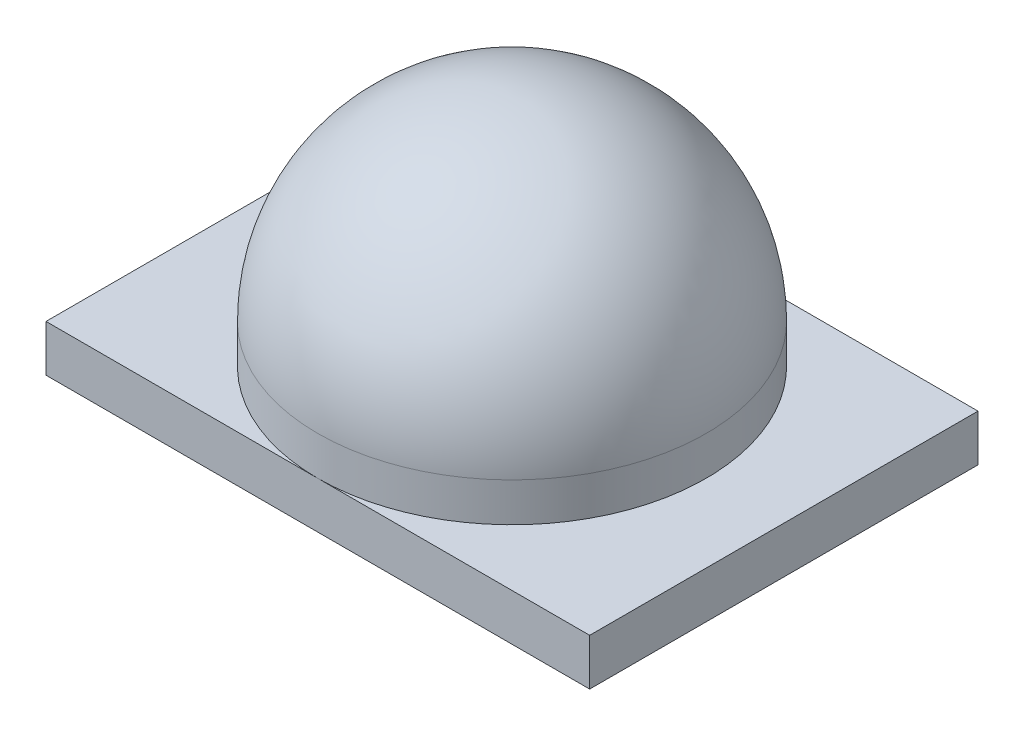
ISO-10303-21;
HEADER;
FILE_DESCRIPTION(('STEP AP214'),'2;1');
FILE_NAME('part.step','',(''),(''),'','','');
FILE_SCHEMA(('AUTOMOTIVE_DESIGN { 1 0 10303 214 1 1 1 1 }'));
ENDSEC;
DATA;
#1=APPLICATION_CONTEXT('core data for automotive mechanical design processes');
#2=APPLICATION_PROTOCOL_DEFINITION('international standard','automotive_design',2000,#1);
#3=PRODUCT_CONTEXT('',#1,'mechanical');
#4=PRODUCT('Part','Part','',(#3));
#5=PRODUCT_RELATED_PRODUCT_CATEGORY('part','',(#4));
#6=PRODUCT_DEFINITION_FORMATION('','',#4);
#7=PRODUCT_DEFINITION_CONTEXT('part definition',#1,'design');
#8=PRODUCT_DEFINITION('design','',#6,#7);
#9=PRODUCT_DEFINITION_SHAPE('','',#8);
#10=(LENGTH_UNIT() NAMED_UNIT(*) SI_UNIT(.MILLI.,.METRE.));
#11=(NAMED_UNIT(*) PLANE_ANGLE_UNIT() SI_UNIT($,.RADIAN.));
#12=(NAMED_UNIT(*) SI_UNIT($,.STERADIAN.) SOLID_ANGLE_UNIT());
#13=UNCERTAINTY_MEASURE_WITH_UNIT(LENGTH_MEASURE(1.E-05),#10,'distance_accuracy_value','');
#14=(GEOMETRIC_REPRESENTATION_CONTEXT(3) GLOBAL_UNCERTAINTY_ASSIGNED_CONTEXT((#13)) GLOBAL_UNIT_ASSIGNED_CONTEXT((#10,
#11,#12)) REPRESENTATION_CONTEXT('',''));
#15=CARTESIAN_POINT('',(0.,0.,0.));
#16=DIRECTION('',(0.,0.,1.));
#17=DIRECTION('',(1.,0.,0.));
#18=AXIS2_PLACEMENT_3D('',#15,#16,#17);
#19=CARTESIAN_POINT('',(0.,3.,0.));
#20=DIRECTION('',(0.,1.,0.));
#21=DIRECTION('',(0.,0.,1.));
#22=AXIS2_PLACEMENT_3D('',#19,#20,#21);
#23=PLANE('',#22);
#24=CARTESIAN_POINT('',(0.,3.,0.));
#25=DIRECTION('',(0.,1.,0.));
#26=DIRECTION('',(0.,0.,1.));
#27=AXIS2_PLACEMENT_3D('',#24,#25,#26);
#28=CIRCLE('',#27,12.5);
#29=CARTESIAN_POINT('',(0.,3.,12.5));
#30=VERTEX_POINT('',#29);
#31=CARTESIAN_POINT('',(0.,3.,-12.5));
#32=VERTEX_POINT('',#31);
#33=EDGE_CURVE('E115',#30,#32,#28,.T.);
#34=ORIENTED_EDGE('',*,*,#33,.F.);
#35=DIRECTION('',(1.,0.,0.));
#36=VECTOR('',#35,1.);
#37=CARTESIAN_POINT('',(-17.5,3.,12.5));
#38=LINE('',#37,#36);
#39=CARTESIAN_POINT('',(17.5,3.,12.5));
#40=VERTEX_POINT('',#39);
#41=EDGE_CURVE('E103',#30,#40,#38,.T.);
#42=ORIENTED_EDGE('',*,*,#41,.T.);
#43=DIRECTION('',(0.,0.,-1.));
#44=VECTOR('',#43,1.);
#45=CARTESIAN_POINT('',(17.5,3.,-12.5));
#46=LINE('',#45,#44);
#47=CARTESIAN_POINT('',(17.5,3.,-12.5));
#48=VERTEX_POINT('',#47);
#49=EDGE_CURVE('E102',#40,#48,#46,.T.);
#50=ORIENTED_EDGE('',*,*,#49,.T.);
#51=DIRECTION('',(-1.,0.,0.));
#52=VECTOR('',#51,1.);
#53=CARTESIAN_POINT('',(-17.5,3.,-12.5));
#54=LINE('',#53,#52);
#55=EDGE_CURVE('E117',#48,#32,#54,.T.);
#56=ORIENTED_EDGE('',*,*,#55,.T.);
#57=EDGE_LOOP('',(#34,#42,#50,#56));
#58=FACE_BOUND('',#57,.T.);
#59=ADVANCED_FACE('F45',(#58),#23,.T.);
#60=CARTESIAN_POINT('',(-17.5,3.,-12.5));
#61=DIRECTION('',(1.,0.,0.));
#62=DIRECTION('',(0.,0.,-1.));
#63=AXIS2_PLACEMENT_3D('',#60,#61,#62);
#64=PLANE('',#63);
#65=DIRECTION('',(0.,0.,1.));
#66=VECTOR('',#65,1.);
#67=CARTESIAN_POINT('',(-17.5,0.,-12.5));
#68=LINE('',#67,#66);
#69=CARTESIAN_POINT('',(-17.5,0.,-12.5));
#70=VERTEX_POINT('',#69);
#71=CARTESIAN_POINT('',(-17.5,0.,12.5));
#72=VERTEX_POINT('',#71);
#73=EDGE_CURVE('E120',#70,#72,#68,.T.);
#74=ORIENTED_EDGE('',*,*,#73,.T.);
#75=DIRECTION('',(0.,-1.,0.));
#76=VECTOR('',#75,1.);
#77=CARTESIAN_POINT('',(-17.5,3.,12.5));
#78=LINE('',#77,#76);
#79=CARTESIAN_POINT('',(-17.5,3.,12.5));
#80=VERTEX_POINT('',#79);
#81=EDGE_CURVE('E124',#80,#72,#78,.T.);
#82=ORIENTED_EDGE('',*,*,#81,.F.);
#83=DIRECTION('',(0.,0.,1.));
#84=VECTOR('',#83,1.);
#85=CARTESIAN_POINT('',(-17.5,3.,-12.5));
#86=LINE('',#85,#84);
#87=CARTESIAN_POINT('',(-17.5,3.,-12.5));
#88=VERTEX_POINT('',#87);
#89=EDGE_CURVE('E99',#88,#80,#86,.T.);
#90=ORIENTED_EDGE('',*,*,#89,.F.);
#91=DIRECTION('',(0.,-1.,0.));
#92=VECTOR('',#91,1.);
#93=CARTESIAN_POINT('',(-17.5,3.,-12.5));
#94=LINE('',#93,#92);
#95=EDGE_CURVE('E133',#88,#70,#94,.T.);
#96=ORIENTED_EDGE('',*,*,#95,.T.);
#97=EDGE_LOOP('',(#74,#82,#90,#96));
#98=FACE_BOUND('',#97,.T.);
#99=ADVANCED_FACE('F159',(#98),#64,.F.);
#100=CARTESIAN_POINT('',(-17.5,3.,12.5));
#101=DIRECTION('',(0.,0.,-1.));
#102=DIRECTION('',(-1.,0.,0.));
#103=AXIS2_PLACEMENT_3D('',#100,#101,#102);
#104=PLANE('',#103);
#105=DIRECTION('',(1.,0.,0.));
#106=VECTOR('',#105,1.);
#107=CARTESIAN_POINT('',(-17.5,0.,12.5));
#108=LINE('',#107,#106);
#109=CARTESIAN_POINT('',(17.5,0.,12.5));
#110=VERTEX_POINT('',#109);
#111=EDGE_CURVE('E137',#72,#110,#108,.T.);
#112=ORIENTED_EDGE('',*,*,#111,.T.);
#113=DIRECTION('',(0.,-1.,0.));
#114=VECTOR('',#113,1.);
#115=CARTESIAN_POINT('',(17.5,3.,12.5));
#116=LINE('',#115,#114);
#117=EDGE_CURVE('E109',#40,#110,#116,.T.);
#118=ORIENTED_EDGE('',*,*,#117,.F.);
#119=ORIENTED_EDGE('',*,*,#41,.F.);
#120=EDGE_CURVE('E94',#80,#30,#38,.T.);
#121=ORIENTED_EDGE('',*,*,#120,.F.);
#122=ORIENTED_EDGE('',*,*,#81,.T.);
#123=EDGE_LOOP('',(#112,#118,#119,#121,#122));
#124=FACE_BOUND('',#123,.T.);
#125=ADVANCED_FACE('F107',(#124),#104,.F.);
#126=CARTESIAN_POINT('',(17.5,3.,-12.5));
#127=DIRECTION('',(-1.,0.,0.));
#128=DIRECTION('',(0.,0.,1.));
#129=AXIS2_PLACEMENT_3D('',#126,#127,#128);
#130=PLANE('',#129);
#131=DIRECTION('',(0.,0.,-1.));
#132=VECTOR('',#131,1.);
#133=CARTESIAN_POINT('',(17.5,0.,-12.5));
#134=LINE('',#133,#132);
#135=CARTESIAN_POINT('',(17.5,0.,-12.5));
#136=VERTEX_POINT('',#135);
#137=EDGE_CURVE('E140',#110,#136,#134,.T.);
#138=ORIENTED_EDGE('',*,*,#137,.T.);
#139=DIRECTION('',(0.,-1.,0.));
#140=VECTOR('',#139,1.);
#141=CARTESIAN_POINT('',(17.5,3.,-12.5));
#142=LINE('',#141,#140);
#143=EDGE_CURVE('E147',#48,#136,#142,.T.);
#144=ORIENTED_EDGE('',*,*,#143,.F.);
#145=ORIENTED_EDGE('',*,*,#49,.F.);
#146=ORIENTED_EDGE('',*,*,#117,.T.);
#147=EDGE_LOOP('',(#138,#144,#145,#146));
#148=FACE_BOUND('',#147,.T.);
#149=ADVANCED_FACE('F153',(#148),#130,.F.);
#150=CARTESIAN_POINT('',(-17.5,3.,-12.5));
#151=DIRECTION('',(0.,0.,1.));
#152=DIRECTION('',(1.,0.,0.));
#153=AXIS2_PLACEMENT_3D('',#150,#151,#152);
#154=PLANE('',#153);
#155=DIRECTION('',(-1.,0.,0.));
#156=VECTOR('',#155,1.);
#157=CARTESIAN_POINT('',(-17.5,0.,-12.5));
#158=LINE('',#157,#156);
#159=EDGE_CURVE('E87',#136,#70,#158,.T.);
#160=ORIENTED_EDGE('',*,*,#159,.T.);
#161=ORIENTED_EDGE('',*,*,#95,.F.);
#162=EDGE_CURVE('E65',#32,#88,#54,.T.);
#163=ORIENTED_EDGE('',*,*,#162,.F.);
#164=ORIENTED_EDGE('',*,*,#55,.F.);
#165=ORIENTED_EDGE('',*,*,#143,.T.);
#166=EDGE_LOOP('',(#160,#161,#163,#164,#165));
#167=FACE_BOUND('',#166,.T.);
#168=ADVANCED_FACE('F160',(#167),#154,.F.);
#169=EDGE_CURVE('E54',#32,#30,#28,.T.);
#170=ORIENTED_EDGE('',*,*,#169,.F.);
#171=ORIENTED_EDGE('',*,*,#162,.T.);
#172=ORIENTED_EDGE('',*,*,#89,.T.);
#173=ORIENTED_EDGE('',*,*,#120,.T.);
#174=EDGE_LOOP('',(#170,#171,#172,#173));
#175=FACE_BOUND('',#174,.T.);
#176=ADVANCED_FACE('F97',(#175),#23,.T.);
#177=CARTESIAN_POINT('',(0.,0.,0.));
#178=DIRECTION('',(0.,1.,0.));
#179=DIRECTION('',(0.,0.,1.));
#180=AXIS2_PLACEMENT_3D('',#177,#178,#179);
#181=PLANE('',#180);
#182=ORIENTED_EDGE('',*,*,#73,.F.);
#183=ORIENTED_EDGE('',*,*,#159,.F.);
#184=ORIENTED_EDGE('',*,*,#137,.F.);
#185=ORIENTED_EDGE('',*,*,#111,.F.);
#186=EDGE_LOOP('',(#182,#183,#184,#185));
#187=FACE_BOUND('',#186,.T.);
#188=ADVANCED_FACE('F157',(#187),#181,.F.);
#189=CARTESIAN_POINT('',(0.,18.,0.));
#190=DIRECTION('',(0.,-1.,0.));
#191=DIRECTION('',(0.,0.,-1.));
#192=AXIS2_PLACEMENT_3D('',#189,#190,#191);
#193=CYLINDRICAL_SURFACE('',#192,12.5);
#194=CARTESIAN_POINT('',(0.,5.5,0.));
#195=DIRECTION('',(0.,-1.,0.));
#196=DIRECTION('',(0.,0.,-1.));
#197=AXIS2_PLACEMENT_3D('',#194,#195,#196);
#198=CIRCLE('',#197,12.5);
#199=CARTESIAN_POINT('',(0.,5.5,-12.5));
#200=VERTEX_POINT('',#199);
#201=EDGE_CURVE('E11',#200,#200,#198,.T.);
#202=ORIENTED_EDGE('',*,*,#201,.T.);
#203=EDGE_LOOP('',(#202));
#204=FACE_BOUND('',#203,.T.);
#205=ORIENTED_EDGE('',*,*,#33,.T.);
#206=ORIENTED_EDGE('',*,*,#169,.T.);
#207=EDGE_LOOP('',(#205,#206));
#208=FACE_BOUND('',#207,.T.);
#209=ADVANCED_FACE('F122',(#204,#208),#193,.T.);
#210=CARTESIAN_POINT('',(0.,5.5,0.));
#211=DIRECTION('',(0.,1.,0.));
#212=DIRECTION('',(0.,0.,1.));
#213=AXIS2_PLACEMENT_3D('',#210,#211,#212);
#214=SPHERICAL_SURFACE('',#213,12.5);
#215=ORIENTED_EDGE('',*,*,#201,.F.);
#216=EDGE_LOOP('',(#215));
#217=FACE_BOUND('',#216,.T.);
#218=ADVANCED_FACE('F47',(#217),#214,.T.);
#219=CLOSED_SHELL('',(#59,#99,#125,#149,#168,#176,#188,#209,#218));
#220=MANIFOLD_SOLID_BREP('B2',#219);
#221=ADVANCED_BREP_SHAPE_REPRESENTATION('',(#18,#220),#14);
#222=SHAPE_DEFINITION_REPRESENTATION(#9,#221);
ENDSEC;
END-ISO-10303-21;
